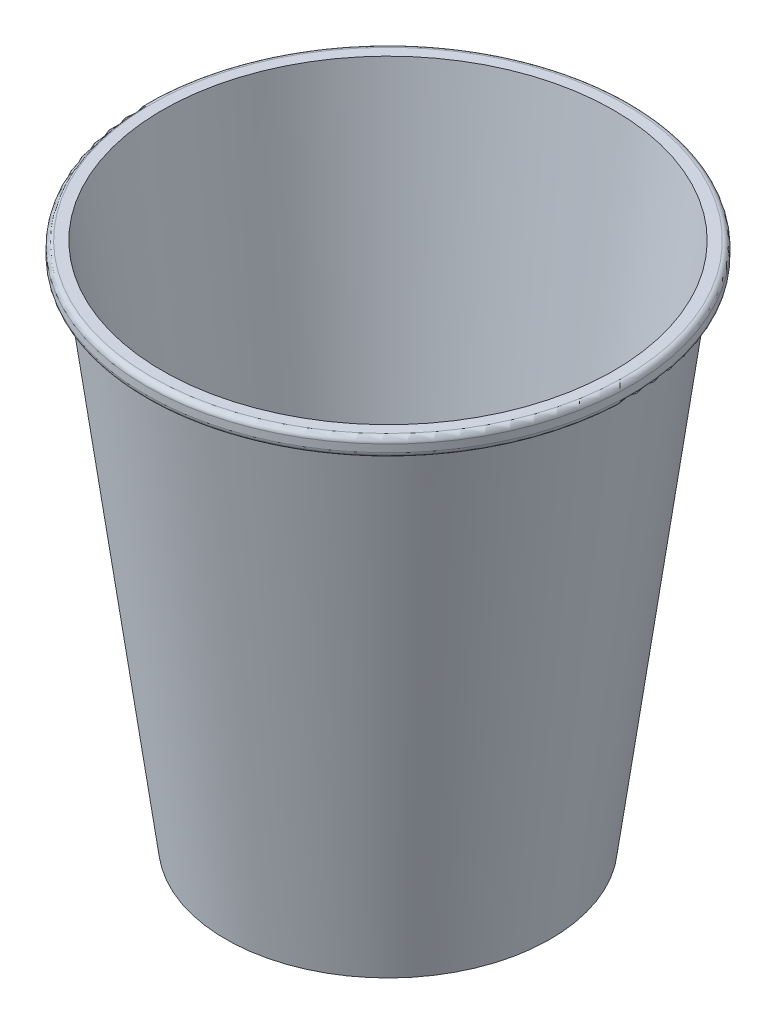
ISO-10303-21;
HEADER;
FILE_DESCRIPTION(('STEP AP214'),'2;1');
FILE_NAME('part.step','',(''),(''),'','','');
FILE_SCHEMA(('AUTOMOTIVE_DESIGN { 1 0 10303 214 1 1 1 1 }'));
ENDSEC;
DATA;
#1=APPLICATION_CONTEXT('core data for automotive mechanical design processes');
#2=APPLICATION_PROTOCOL_DEFINITION('international standard','automotive_design',2000,#1);
#3=PRODUCT_CONTEXT('',#1,'mechanical');
#4=PRODUCT('Part','Part','',(#3));
#5=PRODUCT_RELATED_PRODUCT_CATEGORY('part','',(#4));
#6=PRODUCT_DEFINITION_FORMATION('','',#4);
#7=PRODUCT_DEFINITION_CONTEXT('part definition',#1,'design');
#8=PRODUCT_DEFINITION('design','',#6,#7);
#9=PRODUCT_DEFINITION_SHAPE('','',#8);
#10=(LENGTH_UNIT() NAMED_UNIT(*) SI_UNIT(.MILLI.,.METRE.));
#11=(NAMED_UNIT(*) PLANE_ANGLE_UNIT() SI_UNIT($,.RADIAN.));
#12=(NAMED_UNIT(*) SI_UNIT($,.STERADIAN.) SOLID_ANGLE_UNIT());
#13=UNCERTAINTY_MEASURE_WITH_UNIT(LENGTH_MEASURE(1.E-05),#10,'distance_accuracy_value','');
#14=(GEOMETRIC_REPRESENTATION_CONTEXT(3) GLOBAL_UNCERTAINTY_ASSIGNED_CONTEXT((#13)) GLOBAL_UNIT_ASSIGNED_CONTEXT((#10,
#11,#12)) REPRESENTATION_CONTEXT('',''));
#15=CARTESIAN_POINT('',(0.,0.,0.));
#16=DIRECTION('',(0.,0.,1.));
#17=DIRECTION('',(1.,0.,0.));
#18=AXIS2_PLACEMENT_3D('',#15,#16,#17);
#19=CARTESIAN_POINT('',(30.2085806745069,0.,0.));
#20=DIRECTION('',(0.,-1.,0.));
#21=DIRECTION('',(0.,0.,-1.));
#22=AXIS2_PLACEMENT_3D('',#19,#20,#21);
#23=PLANE('',#22);
#24=CARTESIAN_POINT('',(0.,0.,0.));
#25=DIRECTION('',(0.,-1.,0.));
#26=DIRECTION('',(0.,0.,-1.));
#27=AXIS2_PLACEMENT_3D('',#24,#25,#26);
#28=CIRCLE('',#27,30.2085806745069);
#29=CARTESIAN_POINT('',(0.,0.,-30.2085806745069));
#30=VERTEX_POINT('',#29);
#31=EDGE_CURVE('E70',#30,#30,#28,.T.);
#32=ORIENTED_EDGE('',*,*,#31,.T.);
#33=EDGE_LOOP('',(#32));
#34=FACE_BOUND('',#33,.T.);
#35=CARTESIAN_POINT('',(0.,0.,0.));
#36=DIRECTION('',(0.,-1.,0.));
#37=DIRECTION('',(0.,0.,-1.));
#38=AXIS2_PLACEMENT_3D('',#35,#36,#37);
#39=CIRCLE('',#38,29.2);
#40=CARTESIAN_POINT('',(0.,0.,-29.2));
#41=VERTEX_POINT('',#40);
#42=EDGE_CURVE('E87',#41,#41,#39,.T.);
#43=ORIENTED_EDGE('',*,*,#42,.F.);
#44=EDGE_LOOP('',(#43));
#45=FACE_BOUND('',#44,.T.);
#46=ADVANCED_FACE('F43',(#34,#45),#23,.T.);
#47=CARTESIAN_POINT('',(0.,0.,0.));
#48=DIRECTION('',(0.,1.,0.));
#49=DIRECTION('',(0.,0.,1.));
#50=AXIS2_PLACEMENT_3D('',#47,#48,#49);
#51=CONICAL_SURFACE('',#50,30.2085806745069,0.130535541479);
#52=CARTESIAN_POINT('',(0.,94.1,0.));
#53=DIRECTION('',(0.,-1.,0.));
#54=DIRECTION('',(0.,0.,-1.));
#55=AXIS2_PLACEMENT_3D('',#52,#53,#54);
#56=CIRCLE('',#55,42.5622217001479);
#57=CARTESIAN_POINT('',(0.,94.1,-42.5622217001479));
#58=VERTEX_POINT('',#57);
#59=EDGE_CURVE('E72',#58,#58,#56,.T.);
#60=ORIENTED_EDGE('',*,*,#59,.T.);
#61=EDGE_LOOP('',(#60));
#62=FACE_BOUND('',#61,.T.);
#63=ORIENTED_EDGE('',*,*,#31,.F.);
#64=EDGE_LOOP('',(#63));
#65=FACE_BOUND('',#64,.T.);
#66=ADVANCED_FACE('F96',(#62,#65),#51,.T.);
#67=CARTESIAN_POINT('',(42.5622217001479,94.1,0.));
#68=DIRECTION('',(0.,-1.,0.));
#69=DIRECTION('',(0.,0.,-1.));
#70=AXIS2_PLACEMENT_3D('',#67,#68,#69);
#71=PLANE('',#70);
#72=CARTESIAN_POINT('',(0.,94.1,0.));
#73=DIRECTION('',(0.,-1.,0.));
#74=DIRECTION('',(0.,0.,-1.));
#75=AXIS2_PLACEMENT_3D('',#72,#73,#74);
#76=CIRCLE('',#75,44.);
#77=CARTESIAN_POINT('',(0.,94.1,-44.));
#78=VERTEX_POINT('',#77);
#79=EDGE_CURVE('E61',#78,#78,#76,.T.);
#80=ORIENTED_EDGE('',*,*,#79,.T.);
#81=EDGE_LOOP('',(#80));
#82=FACE_BOUND('',#81,.T.);
#83=ORIENTED_EDGE('',*,*,#59,.F.);
#84=EDGE_LOOP('',(#83));
#85=FACE_BOUND('',#84,.T.);
#86=ADVANCED_FACE('F105',(#82,#85),#71,.T.);
#87=CARTESIAN_POINT('',(0.,0.,0.));
#88=DIRECTION('',(0.,-1.,0.));
#89=DIRECTION('',(0.,0.,-1.));
#90=AXIS2_PLACEMENT_3D('',#87,#88,#89);
#91=CYLINDRICAL_SURFACE('',#90,45.);
#92=CARTESIAN_POINT('',(0.,95.1,0.));
#93=DIRECTION('',(0.,-1.,0.));
#94=DIRECTION('',(0.,0.,-1.));
#95=AXIS2_PLACEMENT_3D('',#92,#93,#94);
#96=CIRCLE('',#95,45.);
#97=CARTESIAN_POINT('',(0.,95.1,-45.));
#98=VERTEX_POINT('',#97);
#99=EDGE_CURVE('E51',#98,#98,#96,.F.);
#100=ORIENTED_EDGE('',*,*,#99,.T.);
#101=EDGE_LOOP('',(#100));
#102=FACE_BOUND('',#101,.T.);
#103=CARTESIAN_POINT('',(0.,96.5,0.));
#104=DIRECTION('',(0.,1.,0.));
#105=DIRECTION('',(0.,0.,1.));
#106=AXIS2_PLACEMENT_3D('',#103,#104,#105);
#107=CIRCLE('',#106,45.);
#108=CARTESIAN_POINT('',(0.,96.5,45.));
#109=VERTEX_POINT('',#108);
#110=EDGE_CURVE('E57',#109,#109,#107,.F.);
#111=ORIENTED_EDGE('',*,*,#110,.T.);
#112=EDGE_LOOP('',(#111));
#113=FACE_BOUND('',#112,.T.);
#114=ADVANCED_FACE('F125',(#102,#113),#91,.T.);
#115=CARTESIAN_POINT('',(42.,97.5,0.));
#116=DIRECTION('',(0.,1.,0.));
#117=DIRECTION('',(0.,0.,1.));
#118=AXIS2_PLACEMENT_3D('',#115,#116,#117);
#119=PLANE('',#118);
#120=CARTESIAN_POINT('',(0.,97.5,0.));
#121=DIRECTION('',(0.,1.,0.));
#122=DIRECTION('',(0.,0.,1.));
#123=AXIS2_PLACEMENT_3D('',#120,#121,#122);
#124=CIRCLE('',#123,44.);
#125=CARTESIAN_POINT('',(0.,97.5,44.));
#126=VERTEX_POINT('',#125);
#127=EDGE_CURVE('E10',#126,#126,#124,.T.);
#128=ORIENTED_EDGE('',*,*,#127,.T.);
#129=EDGE_LOOP('',(#128));
#130=FACE_BOUND('',#129,.T.);
#131=CARTESIAN_POINT('',(0.,97.5,0.));
#132=DIRECTION('',(0.,-1.,0.));
#133=DIRECTION('',(0.,0.,-1.));
#134=AXIS2_PLACEMENT_3D('',#131,#132,#133);
#135=CIRCLE('',#134,42.);
#136=CARTESIAN_POINT('',(0.,97.5,-42.));
#137=VERTEX_POINT('',#136);
#138=EDGE_CURVE('E73',#137,#137,#135,.T.);
#139=ORIENTED_EDGE('',*,*,#138,.T.);
#140=EDGE_LOOP('',(#139));
#141=FACE_BOUND('',#140,.T.);
#142=ADVANCED_FACE('F129',(#130,#141),#119,.T.);
#143=CARTESIAN_POINT('',(0.,97.5,0.));
#144=DIRECTION('',(0.,1.,0.));
#145=DIRECTION('',(0.,0.,1.));
#146=AXIS2_PLACEMENT_3D('',#143,#144,#145);
#147=CONICAL_SURFACE('',#146,42.,0.130535541479);
#148=CARTESIAN_POINT('',(0.,7.5,0.));
#149=DIRECTION('',(0.,-1.,0.));
#150=DIRECTION('',(0.,0.,-1.));
#151=AXIS2_PLACEMENT_3D('',#148,#149,#150);
#152=CIRCLE('',#151,30.1846153846154);
#153=CARTESIAN_POINT('',(0.,7.5,-30.1846153846154));
#154=VERTEX_POINT('',#153);
#155=EDGE_CURVE('E78',#154,#154,#152,.T.);
#156=ORIENTED_EDGE('',*,*,#155,.T.);
#157=EDGE_LOOP('',(#156));
#158=FACE_BOUND('',#157,.T.);
#159=ORIENTED_EDGE('',*,*,#138,.F.);
#160=EDGE_LOOP('',(#159));
#161=FACE_BOUND('',#160,.T.);
#162=ADVANCED_FACE('F132',(#158,#161),#147,.F.);
#163=CARTESIAN_POINT('',(0.,7.5,0.));
#164=DIRECTION('',(0.,1.,0.));
#165=DIRECTION('',(0.,0.,1.));
#166=AXIS2_PLACEMENT_3D('',#163,#164,#165);
#167=PLANE('',#166);
#168=ORIENTED_EDGE('',*,*,#155,.F.);
#169=EDGE_LOOP('',(#168));
#170=FACE_BOUND('',#169,.T.);
#171=ADVANCED_FACE('F138',(#170),#167,.T.);
#172=CARTESIAN_POINT('',(30.0533333333333,6.5,0.));
#173=DIRECTION('',(0.,-1.,0.));
#174=DIRECTION('',(0.,0.,-1.));
#175=AXIS2_PLACEMENT_3D('',#172,#173,#174);
#176=PLANE('',#175);
#177=CARTESIAN_POINT('',(0.,6.5,0.));
#178=DIRECTION('',(0.,-1.,0.));
#179=DIRECTION('',(0.,0.,-1.));
#180=AXIS2_PLACEMENT_3D('',#177,#178,#179);
#181=CIRCLE('',#180,30.0533333333333);
#182=CARTESIAN_POINT('',(0.,6.5,-30.0533333333333));
#183=VERTEX_POINT('',#182);
#184=EDGE_CURVE('E81',#183,#183,#181,.T.);
#185=ORIENTED_EDGE('',*,*,#184,.T.);
#186=EDGE_LOOP('',(#185));
#187=FACE_BOUND('',#186,.T.);
#188=ADVANCED_FACE('F113',(#187),#176,.T.);
#189=CARTESIAN_POINT('',(0.,6.5,0.));
#190=DIRECTION('',(0.,1.,0.));
#191=DIRECTION('',(0.,0.,1.));
#192=AXIS2_PLACEMENT_3D('',#189,#190,#191);
#193=CONICAL_SURFACE('',#192,30.0533333333333,0.130535541479001);
#194=ORIENTED_EDGE('',*,*,#42,.T.);
#195=EDGE_LOOP('',(#194));
#196=FACE_BOUND('',#195,.T.);
#197=ORIENTED_EDGE('',*,*,#184,.F.);
#198=EDGE_LOOP('',(#197));
#199=FACE_BOUND('',#198,.T.);
#200=ADVANCED_FACE('F95',(#196,#199),#193,.F.);
#201=CARTESIAN_POINT('',(0.,95.1,0.));
#202=DIRECTION('',(0.,-1.,0.));
#203=DIRECTION('',(0.,0.,-1.));
#204=AXIS2_PLACEMENT_3D('',#201,#202,#203);
#205=TOROIDAL_SURFACE('',#204,44.,1.);
#206=ORIENTED_EDGE('',*,*,#99,.F.);
#207=EDGE_LOOP('',(#206));
#208=FACE_BOUND('',#207,.T.);
#209=ORIENTED_EDGE('',*,*,#79,.F.);
#210=EDGE_LOOP('',(#209));
#211=FACE_BOUND('',#210,.T.);
#212=ADVANCED_FACE('F106',(#208,#211),#205,.T.);
#213=CARTESIAN_POINT('',(0.,96.5,0.));
#214=DIRECTION('',(0.,1.,0.));
#215=DIRECTION('',(0.,0.,1.));
#216=AXIS2_PLACEMENT_3D('',#213,#214,#215);
#217=TOROIDAL_SURFACE('',#216,44.,1.);
#218=ORIENTED_EDGE('',*,*,#127,.F.);
#219=EDGE_LOOP('',(#218));
#220=FACE_BOUND('',#219,.T.);
#221=ORIENTED_EDGE('',*,*,#110,.F.);
#222=EDGE_LOOP('',(#221));
#223=FACE_BOUND('',#222,.T.);
#224=ADVANCED_FACE('F44',(#220,#223),#217,.T.);
#225=CLOSED_SHELL('',(#46,#66,#86,#114,#142,#162,#171,#188,#200,#212,#224));
#226=MANIFOLD_SOLID_BREP('B2',#225);
#227=ADVANCED_BREP_SHAPE_REPRESENTATION('',(#18,#226),#14);
#228=SHAPE_DEFINITION_REPRESENTATION(#9,#227);
ENDSEC;
END-ISO-10303-21;
